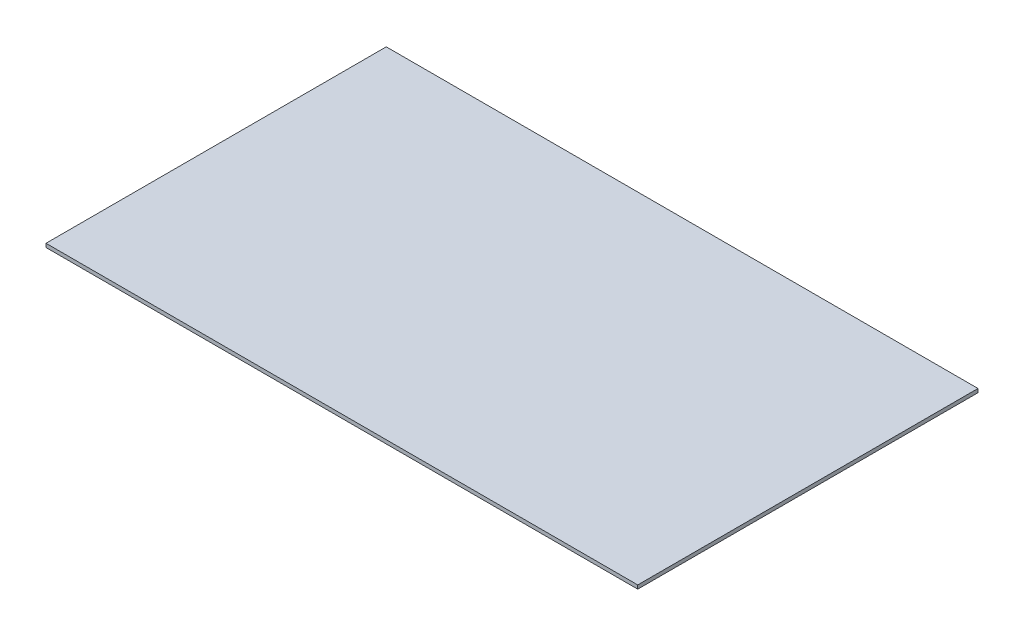
ISO-10303-21;
HEADER;
FILE_DESCRIPTION(('STEP AP214'),'2;1');
FILE_NAME('part.step','',(''),(''),'','','');
FILE_SCHEMA(('AUTOMOTIVE_DESIGN { 1 0 10303 214 1 1 1 1 }'));
ENDSEC;
DATA;
#1=APPLICATION_CONTEXT('core data for automotive mechanical design processes');
#2=APPLICATION_PROTOCOL_DEFINITION('international standard','automotive_design',2000,#1);
#3=PRODUCT_CONTEXT('',#1,'mechanical');
#4=PRODUCT('Part','Part','',(#3));
#5=PRODUCT_RELATED_PRODUCT_CATEGORY('part','',(#4));
#6=PRODUCT_DEFINITION_FORMATION('','',#4);
#7=PRODUCT_DEFINITION_CONTEXT('part definition',#1,'design');
#8=PRODUCT_DEFINITION('design','',#6,#7);
#9=PRODUCT_DEFINITION_SHAPE('','',#8);
#10=(LENGTH_UNIT() NAMED_UNIT(*) SI_UNIT(.MILLI.,.METRE.));
#11=(NAMED_UNIT(*) PLANE_ANGLE_UNIT() SI_UNIT($,.RADIAN.));
#12=(NAMED_UNIT(*) SI_UNIT($,.STERADIAN.) SOLID_ANGLE_UNIT());
#13=UNCERTAINTY_MEASURE_WITH_UNIT(LENGTH_MEASURE(1.E-05),#10,'distance_accuracy_value','');
#14=(GEOMETRIC_REPRESENTATION_CONTEXT(3) GLOBAL_UNCERTAINTY_ASSIGNED_CONTEXT((#13)) GLOBAL_UNIT_ASSIGNED_CONTEXT((#10,
#11,#12)) REPRESENTATION_CONTEXT('',''));
#15=CARTESIAN_POINT('',(0.,0.,0.));
#16=DIRECTION('',(0.,0.,1.));
#17=DIRECTION('',(1.,0.,0.));
#18=AXIS2_PLACEMENT_3D('',#15,#16,#17);
#19=CARTESIAN_POINT('',(254.,3.175,146.05));
#20=DIRECTION('',(-1.,0.,0.));
#21=DIRECTION('',(0.,0.,1.));
#22=AXIS2_PLACEMENT_3D('',#19,#20,#21);
#23=PLANE('',#22);
#24=DIRECTION('',(0.,0.,-1.));
#25=VECTOR('',#24,1.);
#26=CARTESIAN_POINT('',(254.,0.,146.05));
#27=LINE('',#26,#25);
#28=CARTESIAN_POINT('',(254.,0.,146.05));
#29=VERTEX_POINT('',#28);
#30=CARTESIAN_POINT('',(254.,0.,-146.05));
#31=VERTEX_POINT('',#30);
#32=EDGE_CURVE('E107',#29,#31,#27,.T.);
#33=ORIENTED_EDGE('',*,*,#32,.T.);
#34=DIRECTION('',(0.,-1.,0.));
#35=VECTOR('',#34,1.);
#36=CARTESIAN_POINT('',(254.,3.175,-146.05));
#37=LINE('',#36,#35);
#38=CARTESIAN_POINT('',(254.,3.175,-146.05));
#39=VERTEX_POINT('',#38);
#40=EDGE_CURVE('E11',#39,#31,#37,.T.);
#41=ORIENTED_EDGE('',*,*,#40,.F.);
#42=DIRECTION('',(0.,0.,-1.));
#43=VECTOR('',#42,1.);
#44=CARTESIAN_POINT('',(254.,3.175,146.05));
#45=LINE('',#44,#43);
#46=CARTESIAN_POINT('',(254.,3.175,146.05));
#47=VERTEX_POINT('',#46);
#48=EDGE_CURVE('E91',#47,#39,#45,.T.);
#49=ORIENTED_EDGE('',*,*,#48,.F.);
#50=DIRECTION('',(0.,-1.,0.));
#51=VECTOR('',#50,1.);
#52=CARTESIAN_POINT('',(254.,3.175,146.05));
#53=LINE('',#52,#51);
#54=EDGE_CURVE('E103',#47,#29,#53,.T.);
#55=ORIENTED_EDGE('',*,*,#54,.T.);
#56=EDGE_LOOP('',(#33,#41,#49,#55));
#57=FACE_BOUND('',#56,.T.);
#58=ADVANCED_FACE('F39',(#57),#23,.F.);
#59=CARTESIAN_POINT('',(-254.,3.175,-146.05));
#60=DIRECTION('',(0.,0.,1.));
#61=DIRECTION('',(1.,0.,0.));
#62=AXIS2_PLACEMENT_3D('',#59,#60,#61);
#63=PLANE('',#62);
#64=DIRECTION('',(-1.,0.,0.));
#65=VECTOR('',#64,1.);
#66=CARTESIAN_POINT('',(-254.,0.,-146.05));
#67=LINE('',#66,#65);
#68=CARTESIAN_POINT('',(-254.,0.,-146.05));
#69=VERTEX_POINT('',#68);
#70=EDGE_CURVE('E96',#31,#69,#67,.T.);
#71=ORIENTED_EDGE('',*,*,#70,.T.);
#72=DIRECTION('',(0.,-1.,0.));
#73=VECTOR('',#72,1.);
#74=CARTESIAN_POINT('',(-254.,3.175,-146.05));
#75=LINE('',#74,#73);
#76=CARTESIAN_POINT('',(-254.,3.175,-146.05));
#77=VERTEX_POINT('',#76);
#78=EDGE_CURVE('E48',#77,#69,#75,.T.);
#79=ORIENTED_EDGE('',*,*,#78,.F.);
#80=DIRECTION('',(-1.,0.,0.));
#81=VECTOR('',#80,1.);
#82=CARTESIAN_POINT('',(-254.,3.175,-146.05));
#83=LINE('',#82,#81);
#84=EDGE_CURVE('E86',#39,#77,#83,.T.);
#85=ORIENTED_EDGE('',*,*,#84,.F.);
#86=ORIENTED_EDGE('',*,*,#40,.T.);
#87=EDGE_LOOP('',(#71,#79,#85,#86));
#88=FACE_BOUND('',#87,.T.);
#89=ADVANCED_FACE('F95',(#88),#63,.F.);
#90=CARTESIAN_POINT('',(-254.,3.175,146.05));
#91=DIRECTION('',(1.,0.,0.));
#92=DIRECTION('',(0.,0.,-1.));
#93=AXIS2_PLACEMENT_3D('',#90,#91,#92);
#94=PLANE('',#93);
#95=DIRECTION('',(0.,0.,1.));
#96=VECTOR('',#95,1.);
#97=CARTESIAN_POINT('',(-254.,0.,146.05));
#98=LINE('',#97,#96);
#99=CARTESIAN_POINT('',(-254.,0.,146.05));
#100=VERTEX_POINT('',#99);
#101=EDGE_CURVE('E73',#69,#100,#98,.T.);
#102=ORIENTED_EDGE('',*,*,#101,.T.);
#103=DIRECTION('',(0.,-1.,0.));
#104=VECTOR('',#103,1.);
#105=CARTESIAN_POINT('',(-254.,3.175,146.05));
#106=LINE('',#105,#104);
#107=CARTESIAN_POINT('',(-254.,3.175,146.05));
#108=VERTEX_POINT('',#107);
#109=EDGE_CURVE('E98',#108,#100,#106,.T.);
#110=ORIENTED_EDGE('',*,*,#109,.F.);
#111=DIRECTION('',(0.,0.,1.));
#112=VECTOR('',#111,1.);
#113=CARTESIAN_POINT('',(-254.,3.175,146.05));
#114=LINE('',#113,#112);
#115=EDGE_CURVE('E89',#77,#108,#114,.T.);
#116=ORIENTED_EDGE('',*,*,#115,.F.);
#117=ORIENTED_EDGE('',*,*,#78,.T.);
#118=EDGE_LOOP('',(#102,#110,#116,#117));
#119=FACE_BOUND('',#118,.T.);
#120=ADVANCED_FACE('F99',(#119),#94,.F.);
#121=CARTESIAN_POINT('',(-254.,3.175,146.05));
#122=DIRECTION('',(0.,0.,-1.));
#123=DIRECTION('',(-1.,0.,0.));
#124=AXIS2_PLACEMENT_3D('',#121,#122,#123);
#125=PLANE('',#124);
#126=DIRECTION('',(1.,0.,0.));
#127=VECTOR('',#126,1.);
#128=CARTESIAN_POINT('',(-254.,0.,146.05));
#129=LINE('',#128,#127);
#130=EDGE_CURVE('E79',#100,#29,#129,.T.);
#131=ORIENTED_EDGE('',*,*,#130,.T.);
#132=ORIENTED_EDGE('',*,*,#54,.F.);
#133=DIRECTION('',(1.,0.,0.));
#134=VECTOR('',#133,1.);
#135=CARTESIAN_POINT('',(-254.,3.175,146.05));
#136=LINE('',#135,#134);
#137=EDGE_CURVE('E56',#108,#47,#136,.T.);
#138=ORIENTED_EDGE('',*,*,#137,.F.);
#139=ORIENTED_EDGE('',*,*,#109,.T.);
#140=EDGE_LOOP('',(#131,#132,#138,#139));
#141=FACE_BOUND('',#140,.T.);
#142=ADVANCED_FACE('F120',(#141),#125,.F.);
#143=CARTESIAN_POINT('',(0.,3.175,0.));
#144=DIRECTION('',(0.,-1.,0.));
#145=DIRECTION('',(0.,0.,-1.));
#146=AXIS2_PLACEMENT_3D('',#143,#144,#145);
#147=PLANE('',#146);
#148=ORIENTED_EDGE('',*,*,#48,.T.);
#149=ORIENTED_EDGE('',*,*,#84,.T.);
#150=ORIENTED_EDGE('',*,*,#115,.T.);
#151=ORIENTED_EDGE('',*,*,#137,.T.);
#152=EDGE_LOOP('',(#148,#149,#150,#151));
#153=FACE_BOUND('',#152,.T.);
#154=ADVANCED_FACE('F87',(#153),#147,.F.);
#155=CARTESIAN_POINT('',(0.,0.,0.));
#156=DIRECTION('',(0.,-1.,0.));
#157=DIRECTION('',(0.,0.,-1.));
#158=AXIS2_PLACEMENT_3D('',#155,#156,#157);
#159=PLANE('',#158);
#160=ORIENTED_EDGE('',*,*,#32,.F.);
#161=ORIENTED_EDGE('',*,*,#130,.F.);
#162=ORIENTED_EDGE('',*,*,#101,.F.);
#163=ORIENTED_EDGE('',*,*,#70,.F.);
#164=EDGE_LOOP('',(#160,#161,#162,#163));
#165=FACE_BOUND('',#164,.T.);
#166=ADVANCED_FACE('F123',(#165),#159,.T.);
#167=CLOSED_SHELL('',(#58,#89,#120,#142,#154,#166));
#168=MANIFOLD_SOLID_BREP('B2',#167);
#169=ADVANCED_BREP_SHAPE_REPRESENTATION('',(#18,#168),#14);
#170=SHAPE_DEFINITION_REPRESENTATION(#9,#169);
ENDSEC;
END-ISO-10303-21;
